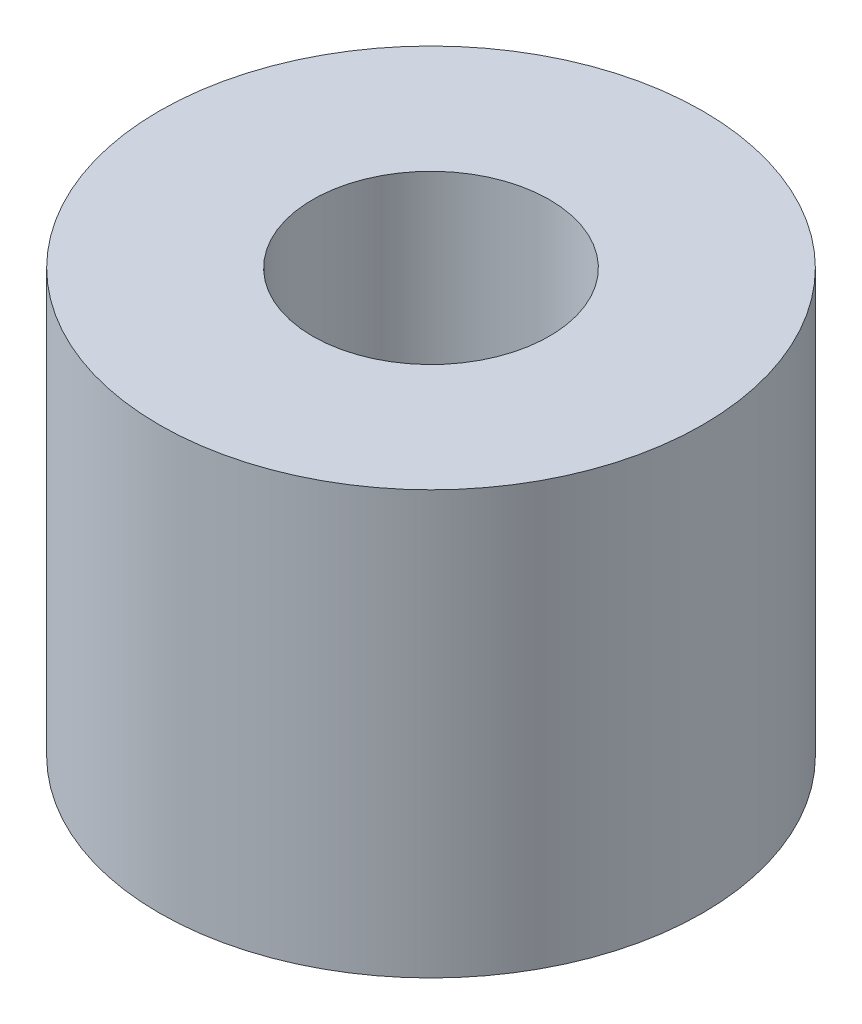
ISO-10303-21;
HEADER;
FILE_DESCRIPTION(('STEP AP214'),'2;1');
FILE_NAME('part.step','',(''),(''),'','','');
FILE_SCHEMA(('AUTOMOTIVE_DESIGN { 1 0 10303 214 1 1 1 1 }'));
ENDSEC;
DATA;
#1=APPLICATION_CONTEXT('core data for automotive mechanical design processes');
#2=APPLICATION_PROTOCOL_DEFINITION('international standard','automotive_design',2000,#1);
#3=PRODUCT_CONTEXT('',#1,'mechanical');
#4=PRODUCT('Part','Part','',(#3));
#5=PRODUCT_RELATED_PRODUCT_CATEGORY('part','',(#4));
#6=PRODUCT_DEFINITION_FORMATION('','',#4);
#7=PRODUCT_DEFINITION_CONTEXT('part definition',#1,'design');
#8=PRODUCT_DEFINITION('design','',#6,#7);
#9=PRODUCT_DEFINITION_SHAPE('','',#8);
#10=(LENGTH_UNIT() NAMED_UNIT(*) SI_UNIT(.MILLI.,.METRE.));
#11=(NAMED_UNIT(*) PLANE_ANGLE_UNIT() SI_UNIT($,.RADIAN.));
#12=(NAMED_UNIT(*) SI_UNIT($,.STERADIAN.) SOLID_ANGLE_UNIT());
#13=UNCERTAINTY_MEASURE_WITH_UNIT(LENGTH_MEASURE(1.E-05),#10,'distance_accuracy_value','');
#14=(GEOMETRIC_REPRESENTATION_CONTEXT(3) GLOBAL_UNCERTAINTY_ASSIGNED_CONTEXT((#13)) GLOBAL_UNIT_ASSIGNED_CONTEXT((#10,
#11,#12)) REPRESENTATION_CONTEXT('',''));
#15=CARTESIAN_POINT('',(0.,0.,0.));
#16=DIRECTION('',(0.,0.,1.));
#17=DIRECTION('',(1.,0.,0.));
#18=AXIS2_PLACEMENT_3D('',#15,#16,#17);
#19=CARTESIAN_POINT('',(0.,8.89,0.));
#20=DIRECTION('',(0.,1.,0.));
#21=DIRECTION('',(0.,0.,1.));
#22=AXIS2_PLACEMENT_3D('',#19,#20,#21);
#23=PLANE('',#22);
#24=CARTESIAN_POINT('',(0.,8.89,0.));
#25=DIRECTION('',(0.,1.,0.));
#26=DIRECTION('',(0.,0.,1.));
#27=AXIS2_PLACEMENT_3D('',#24,#25,#26);
#28=CIRCLE('',#27,5.715);
#29=CARTESIAN_POINT('',(0.,8.89,5.715));
#30=VERTEX_POINT('',#29);
#31=EDGE_CURVE('E10',#30,#30,#28,.T.);
#32=ORIENTED_EDGE('',*,*,#31,.T.);
#33=EDGE_LOOP('',(#32));
#34=FACE_BOUND('',#33,.T.);
#35=CARTESIAN_POINT('',(0.,8.89,0.));
#36=DIRECTION('',(0.,1.,0.));
#37=DIRECTION('',(0.,0.,1.));
#38=AXIS2_PLACEMENT_3D('',#35,#36,#37);
#39=CIRCLE('',#38,2.4892);
#40=CARTESIAN_POINT('',(0.,8.89,2.4892));
#41=VERTEX_POINT('',#40);
#42=EDGE_CURVE('E42',#41,#41,#39,.T.);
#43=ORIENTED_EDGE('',*,*,#42,.F.);
#44=EDGE_LOOP('',(#43));
#45=FACE_BOUND('',#44,.T.);
#46=ADVANCED_FACE('F31',(#34,#45),#23,.T.);
#47=CARTESIAN_POINT('',(0.,0.,0.));
#48=DIRECTION('',(0.,1.,0.));
#49=DIRECTION('',(0.,0.,1.));
#50=AXIS2_PLACEMENT_3D('',#47,#48,#49);
#51=PLANE('',#50);
#52=CARTESIAN_POINT('',(0.,0.,0.));
#53=DIRECTION('',(0.,1.,0.));
#54=DIRECTION('',(0.,0.,1.));
#55=AXIS2_PLACEMENT_3D('',#52,#53,#54);
#56=CIRCLE('',#55,5.715);
#57=CARTESIAN_POINT('',(0.,0.,5.715));
#58=VERTEX_POINT('',#57);
#59=EDGE_CURVE('E35',#58,#58,#56,.T.);
#60=ORIENTED_EDGE('',*,*,#59,.F.);
#61=EDGE_LOOP('',(#60));
#62=FACE_BOUND('',#61,.T.);
#63=CARTESIAN_POINT('',(0.,0.,0.));
#64=DIRECTION('',(0.,1.,0.));
#65=DIRECTION('',(0.,0.,1.));
#66=AXIS2_PLACEMENT_3D('',#63,#64,#65);
#67=CIRCLE('',#66,2.4892);
#68=CARTESIAN_POINT('',(0.,0.,2.4892));
#69=VERTEX_POINT('',#68);
#70=EDGE_CURVE('E44',#69,#69,#67,.T.);
#71=ORIENTED_EDGE('',*,*,#70,.T.);
#72=EDGE_LOOP('',(#71));
#73=FACE_BOUND('',#72,.T.);
#74=ADVANCED_FACE('F54',(#62,#73),#51,.F.);
#75=CARTESIAN_POINT('',(0.,8.89,0.));
#76=DIRECTION('',(0.,-1.,0.));
#77=DIRECTION('',(0.,0.,-1.));
#78=AXIS2_PLACEMENT_3D('',#75,#76,#77);
#79=CYLINDRICAL_SURFACE('',#78,5.715);
#80=ORIENTED_EDGE('',*,*,#31,.F.);
#81=EDGE_LOOP('',(#80));
#82=FACE_BOUND('',#81,.T.);
#83=ORIENTED_EDGE('',*,*,#59,.T.);
#84=EDGE_LOOP('',(#83));
#85=FACE_BOUND('',#84,.T.);
#86=ADVANCED_FACE('F33',(#82,#85),#79,.T.);
#87=CARTESIAN_POINT('',(0.,8.89,0.));
#88=DIRECTION('',(0.,-1.,0.));
#89=DIRECTION('',(0.,0.,-1.));
#90=AXIS2_PLACEMENT_3D('',#87,#88,#89);
#91=CYLINDRICAL_SURFACE('',#90,2.4892);
#92=ORIENTED_EDGE('',*,*,#42,.T.);
#93=EDGE_LOOP('',(#92));
#94=FACE_BOUND('',#93,.T.);
#95=ORIENTED_EDGE('',*,*,#70,.F.);
#96=EDGE_LOOP('',(#95));
#97=FACE_BOUND('',#96,.T.);
#98=ADVANCED_FACE('F50',(#94,#97),#91,.F.);
#99=CLOSED_SHELL('',(#46,#74,#86,#98));
#100=MANIFOLD_SOLID_BREP('B2',#99);
#101=ADVANCED_BREP_SHAPE_REPRESENTATION('',(#18,#100),#14);
#102=SHAPE_DEFINITION_REPRESENTATION(#9,#101);
ENDSEC;
END-ISO-10303-21;
